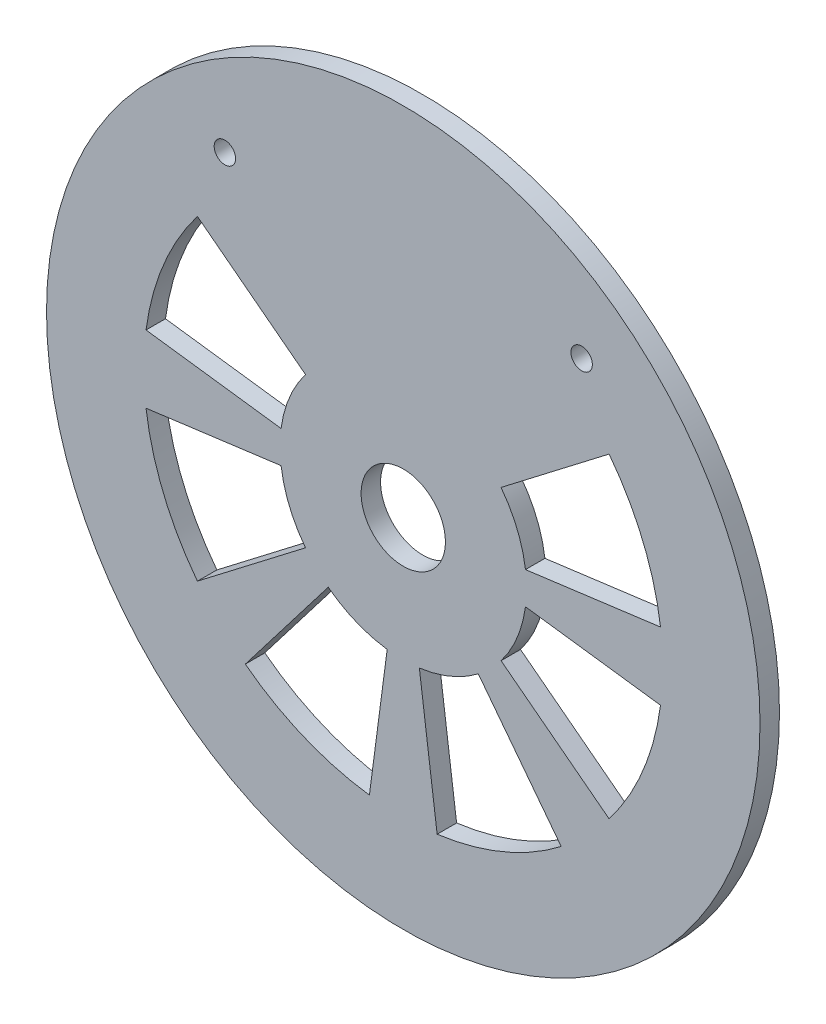
ISO-10303-21;
HEADER;
FILE_DESCRIPTION(('STEP AP214'),'2;1');
FILE_NAME('part.step','',(''),(''),'','','');
FILE_SCHEMA(('AUTOMOTIVE_DESIGN { 1 0 10303 214 1 1 1 1 }'));
ENDSEC;
DATA;
#1=APPLICATION_CONTEXT('core data for automotive mechanical design processes');
#2=APPLICATION_PROTOCOL_DEFINITION('international standard','automotive_design',2000,#1);
#3=PRODUCT_CONTEXT('',#1,'mechanical');
#4=PRODUCT('Part','Part','',(#3));
#5=PRODUCT_RELATED_PRODUCT_CATEGORY('part','',(#4));
#6=PRODUCT_DEFINITION_FORMATION('','',#4);
#7=PRODUCT_DEFINITION_CONTEXT('part definition',#1,'design');
#8=PRODUCT_DEFINITION('design','',#6,#7);
#9=PRODUCT_DEFINITION_SHAPE('','',#8);
#10=(LENGTH_UNIT() NAMED_UNIT(*) SI_UNIT(.MILLI.,.METRE.));
#11=(NAMED_UNIT(*) PLANE_ANGLE_UNIT() SI_UNIT($,.RADIAN.));
#12=(NAMED_UNIT(*) SI_UNIT($,.STERADIAN.) SOLID_ANGLE_UNIT());
#13=UNCERTAINTY_MEASURE_WITH_UNIT(LENGTH_MEASURE(1.E-05),#10,'distance_accuracy_value','');
#14=(GEOMETRIC_REPRESENTATION_CONTEXT(3) GLOBAL_UNCERTAINTY_ASSIGNED_CONTEXT((#13)) GLOBAL_UNIT_ASSIGNED_CONTEXT((#10,
#11,#12)) REPRESENTATION_CONTEXT('',''));
#15=CARTESIAN_POINT('',(0.,0.,0.));
#16=DIRECTION('',(0.,0.,1.));
#17=DIRECTION('',(1.,0.,0.));
#18=AXIS2_PLACEMENT_3D('',#15,#16,#17);
#19=CARTESIAN_POINT('',(0.,0.,3.));
#20=DIRECTION('',(0.,0.,1.));
#21=DIRECTION('',(1.,0.,0.));
#22=AXIS2_PLACEMENT_3D('',#19,#20,#21);
#23=PLANE('',#22);
#24=CARTESIAN_POINT('',(0.,0.,3.));
#25=DIRECTION('',(0.,0.,1.));
#26=DIRECTION('',(1.,0.,0.));
#27=AXIS2_PLACEMENT_3D('',#24,#25,#26);
#28=CIRCLE('',#27,6.5);
#29=CARTESIAN_POINT('',(6.5,0.,3.));
#30=VERTEX_POINT('',#29);
#31=EDGE_CURVE('E295',#30,#30,#28,.T.);
#32=ORIENTED_EDGE('',*,*,#31,.F.);
#33=EDGE_LOOP('',(#32));
#34=FACE_BOUND('',#33,.T.);
#35=CARTESIAN_POINT('',(27.5,35.,3.));
#36=DIRECTION('',(0.,0.,1.));
#37=DIRECTION('',(1.,0.,0.));
#38=AXIS2_PLACEMENT_3D('',#35,#36,#37);
#39=CIRCLE('',#38,1.65);
#40=CARTESIAN_POINT('',(29.15,35.,3.));
#41=VERTEX_POINT('',#40);
#42=EDGE_CURVE('E531',#41,#41,#39,.T.);
#43=ORIENTED_EDGE('',*,*,#42,.F.);
#44=EDGE_LOOP('',(#43));
#45=FACE_BOUND('',#44,.T.);
#46=CARTESIAN_POINT('',(-27.5,35.,3.));
#47=DIRECTION('',(0.,0.,1.));
#48=DIRECTION('',(1.,0.,0.));
#49=AXIS2_PLACEMENT_3D('',#46,#47,#48);
#50=CIRCLE('',#49,1.65);
#51=CARTESIAN_POINT('',(-25.85,35.,3.));
#52=VERTEX_POINT('',#51);
#53=EDGE_CURVE('E540',#52,#52,#50,.T.);
#54=ORIENTED_EDGE('',*,*,#53,.F.);
#55=EDGE_LOOP('',(#54));
#56=FACE_BOUND('',#55,.T.);
#57=CARTESIAN_POINT('',(0.,0.,3.));
#58=DIRECTION('',(0.,0.,1.));
#59=DIRECTION('',(1.,0.,0.));
#60=AXIS2_PLACEMENT_3D('',#57,#58,#59);
#61=CIRCLE('',#60,55.);
#62=CARTESIAN_POINT('',(55.,0.,3.));
#63=VERTEX_POINT('',#62);
#64=EDGE_CURVE('E12',#63,#63,#61,.T.);
#65=ORIENTED_EDGE('',*,*,#64,.T.);
#66=EDGE_LOOP('',(#65));
#67=FACE_BOUND('',#66,.T.);
#68=DIRECTION('',(0.99144486137381,0.130526192220053,0.));
#69=VECTOR('',#68,1.);
#70=CARTESIAN_POINT('',(0.,0.,3.));
#71=LINE('',#70,#69);
#72=CARTESIAN_POINT('',(18.8374523661024,2.479997652181,3.));
#73=VERTEX_POINT('',#72);
#74=CARTESIAN_POINT('',(39.6577944549524,5.22104768880211,3.));
#75=VERTEX_POINT('',#74);
#76=EDGE_CURVE('E503',#73,#75,#71,.T.);
#77=ORIENTED_EDGE('',*,*,#76,.F.);
#78=CARTESIAN_POINT('',(0.,0.,3.));
#79=DIRECTION('',(0.,0.,1.));
#80=DIRECTION('',(1.,0.,0.));
#81=AXIS2_PLACEMENT_3D('',#78,#79,#80);
#82=CIRCLE('',#81,19.);
#83=CARTESIAN_POINT('',(15.0737134655334,11.5664671511657,3.));
#84=VERTEX_POINT('',#83);
#85=EDGE_CURVE('E433',#73,#84,#82,.T.);
#86=ORIENTED_EDGE('',*,*,#85,.T.);
#87=DIRECTION('',(0.793353340291234,0.608761429008723,0.));
#88=VECTOR('',#87,1.);
#89=CARTESIAN_POINT('',(0.,0.,3.));
#90=LINE('',#89,#88);
#91=CARTESIAN_POINT('',(31.7341336116493,24.3504571603489,3.));
#92=VERTEX_POINT('',#91);
#93=EDGE_CURVE('E487',#84,#92,#90,.T.);
#94=ORIENTED_EDGE('',*,*,#93,.T.);
#95=CARTESIAN_POINT('',(0.,0.,3.));
#96=DIRECTION('',(0.,0.,1.));
#97=DIRECTION('',(1.,0.,0.));
#98=AXIS2_PLACEMENT_3D('',#95,#96,#97);
#99=CIRCLE('',#98,40.);
#100=EDGE_CURVE('E506',#75,#92,#99,.T.);
#101=ORIENTED_EDGE('',*,*,#100,.F.);
#102=EDGE_LOOP('',(#77,#86,#94,#101));
#103=FACE_BOUND('',#102,.T.);
#104=DIRECTION('',(0.793353340291235,-0.608761429008721,0.));
#105=VECTOR('',#104,1.);
#106=CARTESIAN_POINT('',(0.,0.,3.));
#107=LINE('',#106,#105);
#108=CARTESIAN_POINT('',(15.0737134655335,-11.5664671511657,3.));
#109=VERTEX_POINT('',#108);
#110=CARTESIAN_POINT('',(31.7341336116494,-24.3504571603489,3.));
#111=VERTEX_POINT('',#110);
#112=EDGE_CURVE('E303',#109,#111,#107,.T.);
#113=ORIENTED_EDGE('',*,*,#112,.F.);
#114=CARTESIAN_POINT('',(0.,0.,3.));
#115=DIRECTION('',(0.,0.,1.));
#116=DIRECTION('',(1.,0.,0.));
#117=AXIS2_PLACEMENT_3D('',#114,#115,#116);
#118=CIRCLE('',#117,19.);
#119=CARTESIAN_POINT('',(18.8374523661024,-2.47999765218096,3.));
#120=VERTEX_POINT('',#119);
#121=EDGE_CURVE('E262',#109,#120,#118,.T.);
#122=ORIENTED_EDGE('',*,*,#121,.T.);
#123=DIRECTION('',(0.991444861373811,-0.130526192220051,0.));
#124=VECTOR('',#123,1.);
#125=CARTESIAN_POINT('',(0.,0.,3.));
#126=LINE('',#125,#124);
#127=CARTESIAN_POINT('',(39.6577944549524,-5.22104768880203,3.));
#128=VERTEX_POINT('',#127);
#129=EDGE_CURVE('E284',#120,#128,#126,.T.);
#130=ORIENTED_EDGE('',*,*,#129,.T.);
#131=CARTESIAN_POINT('',(0.,0.,3.));
#132=DIRECTION('',(0.,0.,1.));
#133=DIRECTION('',(1.,0.,0.));
#134=AXIS2_PLACEMENT_3D('',#131,#132,#133);
#135=CIRCLE('',#134,40.);
#136=EDGE_CURVE('E287',#111,#128,#135,.T.);
#137=ORIENTED_EDGE('',*,*,#136,.F.);
#138=EDGE_LOOP('',(#113,#122,#130,#137));
#139=FACE_BOUND('',#138,.T.);
#140=DIRECTION('',(-0.793353340291231,0.608761429008727,0.));
#141=VECTOR('',#140,1.);
#142=CARTESIAN_POINT('',(0.,0.,3.));
#143=LINE('',#142,#141);
#144=CARTESIAN_POINT('',(-15.0737134655334,11.5664671511658,3.));
#145=VERTEX_POINT('',#144);
#146=CARTESIAN_POINT('',(-31.7341336116492,24.3504571603491,3.));
#147=VERTEX_POINT('',#146);
#148=EDGE_CURVE('E417',#145,#147,#143,.T.);
#149=ORIENTED_EDGE('',*,*,#148,.F.);
#150=CARTESIAN_POINT('',(0.,0.,3.));
#151=DIRECTION('',(0.,0.,1.));
#152=DIRECTION('',(1.,0.,0.));
#153=AXIS2_PLACEMENT_3D('',#150,#151,#152);
#154=CIRCLE('',#153,19.);
#155=CARTESIAN_POINT('',(-18.8374523661024,2.4799976521811,3.));
#156=VERTEX_POINT('',#155);
#157=EDGE_CURVE('E411',#145,#156,#154,.T.);
#158=ORIENTED_EDGE('',*,*,#157,.T.);
#159=DIRECTION('',(-0.99144486137381,0.130526192220058,0.));
#160=VECTOR('',#159,1.);
#161=CARTESIAN_POINT('',(0.,0.,3.));
#162=LINE('',#161,#160);
#163=CARTESIAN_POINT('',(-39.6577944549524,5.22104768880231,3.));
#164=VERTEX_POINT('',#163);
#165=EDGE_CURVE('E402',#156,#164,#162,.T.);
#166=ORIENTED_EDGE('',*,*,#165,.T.);
#167=CARTESIAN_POINT('',(0.,0.,3.));
#168=DIRECTION('',(0.,0.,1.));
#169=DIRECTION('',(1.,0.,0.));
#170=AXIS2_PLACEMENT_3D('',#167,#168,#169);
#171=CIRCLE('',#170,40.);
#172=EDGE_CURVE('E425',#147,#164,#171,.T.);
#173=ORIENTED_EDGE('',*,*,#172,.F.);
#174=EDGE_LOOP('',(#149,#158,#166,#173));
#175=FACE_BOUND('',#174,.T.);
#176=DIRECTION('',(-0.991444861373811,-0.130526192220046,0.));
#177=VECTOR('',#176,1.);
#178=CARTESIAN_POINT('',(0.,0.,3.));
#179=LINE('',#178,#177);
#180=CARTESIAN_POINT('',(-18.8374523661024,-2.47999765218087,3.));
#181=VERTEX_POINT('',#180);
#182=CARTESIAN_POINT('',(-39.6577944549524,-5.22104768880183,3.));
#183=VERTEX_POINT('',#182);
#184=EDGE_CURVE('E465',#181,#183,#179,.T.);
#185=ORIENTED_EDGE('',*,*,#184,.F.);
#186=CARTESIAN_POINT('',(0.,0.,3.));
#187=DIRECTION('',(0.,0.,1.));
#188=DIRECTION('',(1.,0.,0.));
#189=AXIS2_PLACEMENT_3D('',#186,#187,#188);
#190=CIRCLE('',#189,19.);
#191=CARTESIAN_POINT('',(-15.0737134655335,-11.5664671511656,3.));
#192=VERTEX_POINT('',#191);
#193=EDGE_CURVE('E349',#181,#192,#190,.T.);
#194=ORIENTED_EDGE('',*,*,#193,.T.);
#195=DIRECTION('',(-0.793353340291238,-0.608761429008717,0.));
#196=VECTOR('',#195,1.);
#197=CARTESIAN_POINT('',(0.,0.,3.));
#198=LINE('',#197,#196);
#199=CARTESIAN_POINT('',(-31.7341336116495,-24.3504571603487,3.));
#200=VERTEX_POINT('',#199);
#201=EDGE_CURVE('E450',#192,#200,#198,.T.);
#202=ORIENTED_EDGE('',*,*,#201,.T.);
#203=CARTESIAN_POINT('',(0.,0.,3.));
#204=DIRECTION('',(0.,0.,1.));
#205=DIRECTION('',(1.,0.,0.));
#206=AXIS2_PLACEMENT_3D('',#203,#204,#205);
#207=CIRCLE('',#206,40.);
#208=EDGE_CURVE('E468',#183,#200,#207,.T.);
#209=ORIENTED_EDGE('',*,*,#208,.F.);
#210=EDGE_LOOP('',(#185,#194,#202,#209));
#211=FACE_BOUND('',#210,.T.);
#212=DIRECTION('',(-0.608761429008724,-0.793353340291233,0.));
#213=VECTOR('',#212,1.);
#214=CARTESIAN_POINT('',(0.,0.,3.));
#215=LINE('',#214,#213);
#216=CARTESIAN_POINT('',(-11.5664671511658,-15.0737134655334,3.));
#217=VERTEX_POINT('',#216);
#218=CARTESIAN_POINT('',(-24.350457160349,-31.7341336116493,3.));
#219=VERTEX_POINT('',#218);
#220=EDGE_CURVE('E331',#217,#219,#215,.T.);
#221=ORIENTED_EDGE('',*,*,#220,.F.);
#222=CARTESIAN_POINT('',(0.,0.,3.));
#223=DIRECTION('',(0.,0.,1.));
#224=DIRECTION('',(1.,0.,0.));
#225=AXIS2_PLACEMENT_3D('',#222,#223,#224);
#226=CIRCLE('',#225,19.);
#227=CARTESIAN_POINT('',(-2.47999765218103,-18.8374523661024,3.));
#228=VERTEX_POINT('',#227);
#229=EDGE_CURVE('E120',#217,#228,#226,.T.);
#230=ORIENTED_EDGE('',*,*,#229,.T.);
#231=DIRECTION('',(-0.130526192220054,-0.99144486137381,0.));
#232=VECTOR('',#231,1.);
#233=CARTESIAN_POINT('',(0.,0.,3.));
#234=LINE('',#233,#232);
#235=CARTESIAN_POINT('',(-5.22104768880218,-39.6577944549524,3.));
#236=VERTEX_POINT('',#235);
#237=EDGE_CURVE('E319',#228,#236,#234,.T.);
#238=ORIENTED_EDGE('',*,*,#237,.T.);
#239=CARTESIAN_POINT('',(0.,0.,3.));
#240=DIRECTION('',(0.,0.,1.));
#241=DIRECTION('',(1.,0.,0.));
#242=AXIS2_PLACEMENT_3D('',#239,#240,#241);
#243=CIRCLE('',#242,40.);
#244=EDGE_CURVE('E338',#219,#236,#243,.T.);
#245=ORIENTED_EDGE('',*,*,#244,.F.);
#246=EDGE_LOOP('',(#221,#230,#238,#245));
#247=FACE_BOUND('',#246,.T.);
#248=DIRECTION('',(0.130526192220049,-0.991444861373811,0.));
#249=VECTOR('',#248,1.);
#250=CARTESIAN_POINT('',(0.,0.,3.));
#251=LINE('',#250,#249);
#252=CARTESIAN_POINT('',(2.47999765218093,-18.8374523661024,3.));
#253=VERTEX_POINT('',#252);
#254=CARTESIAN_POINT('',(5.22104768880197,-39.6577944549524,3.));
#255=VERTEX_POINT('',#254);
#256=EDGE_CURVE('E376',#253,#255,#251,.T.);
#257=ORIENTED_EDGE('',*,*,#256,.F.);
#258=CARTESIAN_POINT('',(0.,0.,3.));
#259=DIRECTION('',(0.,0.,1.));
#260=DIRECTION('',(1.,0.,0.));
#261=AXIS2_PLACEMENT_3D('',#258,#259,#260);
#262=CIRCLE('',#261,19.);
#263=CARTESIAN_POINT('',(11.5664671511657,-15.0737134655335,3.));
#264=VERTEX_POINT('',#263);
#265=EDGE_CURVE('E108',#253,#264,#262,.T.);
#266=ORIENTED_EDGE('',*,*,#265,.T.);
#267=DIRECTION('',(0.60876142900872,-0.793353340291236,0.));
#268=VECTOR('',#267,1.);
#269=CARTESIAN_POINT('',(0.,0.,3.));
#270=LINE('',#269,#268);
#271=CARTESIAN_POINT('',(24.3504571603488,-31.7341336116494,3.));
#272=VERTEX_POINT('',#271);
#273=EDGE_CURVE('E362',#264,#272,#270,.T.);
#274=ORIENTED_EDGE('',*,*,#273,.T.);
#275=CARTESIAN_POINT('',(0.,0.,3.));
#276=DIRECTION('',(0.,0.,1.));
#277=DIRECTION('',(1.,0.,0.));
#278=AXIS2_PLACEMENT_3D('',#275,#276,#277);
#279=CIRCLE('',#278,40.);
#280=EDGE_CURVE('E379',#255,#272,#279,.T.);
#281=ORIENTED_EDGE('',*,*,#280,.F.);
#282=EDGE_LOOP('',(#257,#266,#274,#281));
#283=FACE_BOUND('',#282,.T.);
#284=ADVANCED_FACE('F91',(#34,#45,#56,#67,#103,#139,#175,#211,#247,#283),#23,.T.);
#285=CARTESIAN_POINT('',(0.,0.,0.));
#286=DIRECTION('',(0.,0.,1.));
#287=DIRECTION('',(1.,0.,0.));
#288=AXIS2_PLACEMENT_3D('',#285,#286,#287);
#289=PLANE('',#288);
#290=CARTESIAN_POINT('',(0.,0.,0.));
#291=DIRECTION('',(0.,0.,1.));
#292=DIRECTION('',(1.,0.,0.));
#293=AXIS2_PLACEMENT_3D('',#290,#291,#292);
#294=CIRCLE('',#293,6.5);
#295=CARTESIAN_POINT('',(6.5,0.,0.));
#296=VERTEX_POINT('',#295);
#297=EDGE_CURVE('E305',#296,#296,#294,.T.);
#298=ORIENTED_EDGE('',*,*,#297,.T.);
#299=EDGE_LOOP('',(#298));
#300=FACE_BOUND('',#299,.T.);
#301=CARTESIAN_POINT('',(0.,0.,0.));
#302=DIRECTION('',(0.,0.,1.));
#303=DIRECTION('',(1.,0.,0.));
#304=AXIS2_PLACEMENT_3D('',#301,#302,#303);
#305=CIRCLE('',#304,19.);
#306=CARTESIAN_POINT('',(-11.5664671511658,-15.0737134655334,0.));
#307=VERTEX_POINT('',#306);
#308=CARTESIAN_POINT('',(-2.47999765218103,-18.8374523661024,0.));
#309=VERTEX_POINT('',#308);
#310=EDGE_CURVE('E316',#307,#309,#305,.T.);
#311=ORIENTED_EDGE('',*,*,#310,.F.);
#312=DIRECTION('',(-0.608761429008724,-0.793353340291233,0.));
#313=VECTOR('',#312,1.);
#314=CARTESIAN_POINT('',(0.,0.,0.));
#315=LINE('',#314,#313);
#316=CARTESIAN_POINT('',(-24.350457160349,-31.7341336116493,0.));
#317=VERTEX_POINT('',#316);
#318=EDGE_CURVE('E317',#307,#317,#315,.T.);
#319=ORIENTED_EDGE('',*,*,#318,.T.);
#320=CARTESIAN_POINT('',(0.,0.,0.));
#321=DIRECTION('',(0.,0.,1.));
#322=DIRECTION('',(1.,0.,0.));
#323=AXIS2_PLACEMENT_3D('',#320,#321,#322);
#324=CIRCLE('',#323,40.);
#325=CARTESIAN_POINT('',(-5.22104768880218,-39.6577944549524,0.));
#326=VERTEX_POINT('',#325);
#327=EDGE_CURVE('E322',#317,#326,#324,.T.);
#328=ORIENTED_EDGE('',*,*,#327,.T.);
#329=DIRECTION('',(-0.130526192220054,-0.99144486137381,0.));
#330=VECTOR('',#329,1.);
#331=CARTESIAN_POINT('',(0.,0.,0.));
#332=LINE('',#331,#330);
#333=EDGE_CURVE('E327',#309,#326,#332,.T.);
#334=ORIENTED_EDGE('',*,*,#333,.F.);
#335=EDGE_LOOP('',(#311,#319,#328,#334));
#336=FACE_BOUND('',#335,.T.);
#337=CARTESIAN_POINT('',(0.,0.,0.));
#338=DIRECTION('',(0.,0.,1.));
#339=DIRECTION('',(1.,0.,0.));
#340=AXIS2_PLACEMENT_3D('',#337,#338,#339);
#341=CIRCLE('',#340,19.);
#342=CARTESIAN_POINT('',(-15.0737134655334,11.5664671511658,0.));
#343=VERTEX_POINT('',#342);
#344=CARTESIAN_POINT('',(-18.8374523661024,2.4799976521811,0.));
#345=VERTEX_POINT('',#344);
#346=EDGE_CURVE('E400',#343,#345,#341,.T.);
#347=ORIENTED_EDGE('',*,*,#346,.F.);
#348=DIRECTION('',(-0.793353340291231,0.608761429008727,0.));
#349=VECTOR('',#348,1.);
#350=CARTESIAN_POINT('',(0.,0.,0.));
#351=LINE('',#350,#349);
#352=CARTESIAN_POINT('',(-31.7341336116492,24.3504571603491,0.));
#353=VERTEX_POINT('',#352);
#354=EDGE_CURVE('E399',#343,#353,#351,.T.);
#355=ORIENTED_EDGE('',*,*,#354,.T.);
#356=CARTESIAN_POINT('',(0.,0.,0.));
#357=DIRECTION('',(0.,0.,1.));
#358=DIRECTION('',(1.,0.,0.));
#359=AXIS2_PLACEMENT_3D('',#356,#357,#358);
#360=CIRCLE('',#359,40.);
#361=CARTESIAN_POINT('',(-39.6577944549524,5.22104768880231,0.));
#362=VERTEX_POINT('',#361);
#363=EDGE_CURVE('E403',#353,#362,#360,.T.);
#364=ORIENTED_EDGE('',*,*,#363,.T.);
#365=DIRECTION('',(-0.99144486137381,0.130526192220058,0.));
#366=VECTOR('',#365,1.);
#367=CARTESIAN_POINT('',(0.,0.,0.));
#368=LINE('',#367,#366);
#369=EDGE_CURVE('E408',#345,#362,#368,.T.);
#370=ORIENTED_EDGE('',*,*,#369,.F.);
#371=EDGE_LOOP('',(#347,#355,#364,#370));
#372=FACE_BOUND('',#371,.T.);
#373=CARTESIAN_POINT('',(0.,0.,0.));
#374=DIRECTION('',(0.,0.,1.));
#375=DIRECTION('',(1.,0.,0.));
#376=AXIS2_PLACEMENT_3D('',#373,#374,#375);
#377=CIRCLE('',#376,19.);
#378=CARTESIAN_POINT('',(18.8374523661024,2.479997652181,0.));
#379=VERTEX_POINT('',#378);
#380=CARTESIAN_POINT('',(15.0737134655334,11.5664671511657,0.));
#381=VERTEX_POINT('',#380);
#382=EDGE_CURVE('E484',#379,#381,#377,.T.);
#383=ORIENTED_EDGE('',*,*,#382,.F.);
#384=DIRECTION('',(0.99144486137381,0.130526192220053,0.));
#385=VECTOR('',#384,1.);
#386=CARTESIAN_POINT('',(0.,0.,0.));
#387=LINE('',#386,#385);
#388=CARTESIAN_POINT('',(39.6577944549524,5.22104768880211,0.));
#389=VERTEX_POINT('',#388);
#390=EDGE_CURVE('E488',#379,#389,#387,.T.);
#391=ORIENTED_EDGE('',*,*,#390,.T.);
#392=CARTESIAN_POINT('',(0.,0.,0.));
#393=DIRECTION('',(0.,0.,1.));
#394=DIRECTION('',(1.,0.,0.));
#395=AXIS2_PLACEMENT_3D('',#392,#393,#394);
#396=CIRCLE('',#395,40.);
#397=CARTESIAN_POINT('',(31.7341336116493,24.3504571603489,0.));
#398=VERTEX_POINT('',#397);
#399=EDGE_CURVE('E492',#389,#398,#396,.T.);
#400=ORIENTED_EDGE('',*,*,#399,.T.);
#401=DIRECTION('',(0.793353340291234,0.608761429008723,0.));
#402=VECTOR('',#401,1.);
#403=CARTESIAN_POINT('',(0.,0.,0.));
#404=LINE('',#403,#402);
#405=EDGE_CURVE('E500',#381,#398,#404,.T.);
#406=ORIENTED_EDGE('',*,*,#405,.F.);
#407=EDGE_LOOP('',(#383,#391,#400,#406));
#408=FACE_BOUND('',#407,.T.);
#409=CARTESIAN_POINT('',(27.5,35.,0.));
#410=DIRECTION('',(0.,0.,1.));
#411=DIRECTION('',(1.,0.,0.));
#412=AXIS2_PLACEMENT_3D('',#409,#410,#411);
#413=CIRCLE('',#412,1.65);
#414=CARTESIAN_POINT('',(29.15,35.,0.));
#415=VERTEX_POINT('',#414);
#416=EDGE_CURVE('E530',#415,#415,#413,.T.);
#417=ORIENTED_EDGE('',*,*,#416,.T.);
#418=EDGE_LOOP('',(#417));
#419=FACE_BOUND('',#418,.T.);
#420=CARTESIAN_POINT('',(-27.5,35.,0.));
#421=DIRECTION('',(0.,0.,1.));
#422=DIRECTION('',(1.,0.,0.));
#423=AXIS2_PLACEMENT_3D('',#420,#421,#422);
#424=CIRCLE('',#423,1.65);
#425=CARTESIAN_POINT('',(-25.85,35.,0.));
#426=VERTEX_POINT('',#425);
#427=EDGE_CURVE('E518',#426,#426,#424,.T.);
#428=ORIENTED_EDGE('',*,*,#427,.T.);
#429=EDGE_LOOP('',(#428));
#430=FACE_BOUND('',#429,.T.);
#431=CARTESIAN_POINT('',(0.,0.,0.));
#432=DIRECTION('',(0.,0.,1.));
#433=DIRECTION('',(1.,0.,0.));
#434=AXIS2_PLACEMENT_3D('',#431,#432,#433);
#435=CIRCLE('',#434,55.);
#436=CARTESIAN_POINT('',(55.,0.,0.));
#437=VERTEX_POINT('',#436);
#438=EDGE_CURVE('E100',#437,#437,#435,.T.);
#439=ORIENTED_EDGE('',*,*,#438,.F.);
#440=EDGE_LOOP('',(#439));
#441=FACE_BOUND('',#440,.T.);
#442=CARTESIAN_POINT('',(0.,0.,0.));
#443=DIRECTION('',(0.,0.,1.));
#444=DIRECTION('',(1.,0.,0.));
#445=AXIS2_PLACEMENT_3D('',#442,#443,#444);
#446=CIRCLE('',#445,19.);
#447=CARTESIAN_POINT('',(15.0737134655335,-11.5664671511657,0.));
#448=VERTEX_POINT('',#447);
#449=CARTESIAN_POINT('',(18.8374523661024,-2.47999765218096,0.));
#450=VERTEX_POINT('',#449);
#451=EDGE_CURVE('E261',#448,#450,#446,.T.);
#452=ORIENTED_EDGE('',*,*,#451,.F.);
#453=DIRECTION('',(0.793353340291235,-0.608761429008721,0.));
#454=VECTOR('',#453,1.);
#455=CARTESIAN_POINT('',(0.,0.,0.));
#456=LINE('',#455,#454);
#457=CARTESIAN_POINT('',(31.7341336116494,-24.3504571603489,0.));
#458=VERTEX_POINT('',#457);
#459=EDGE_CURVE('E273',#448,#458,#456,.T.);
#460=ORIENTED_EDGE('',*,*,#459,.T.);
#461=CARTESIAN_POINT('',(0.,0.,0.));
#462=DIRECTION('',(0.,0.,1.));
#463=DIRECTION('',(1.,0.,0.));
#464=AXIS2_PLACEMENT_3D('',#461,#462,#463);
#465=CIRCLE('',#464,40.);
#466=CARTESIAN_POINT('',(39.6577944549524,-5.22104768880203,0.));
#467=VERTEX_POINT('',#466);
#468=EDGE_CURVE('E276',#458,#467,#465,.T.);
#469=ORIENTED_EDGE('',*,*,#468,.T.);
#470=DIRECTION('',(0.991444861373811,-0.130526192220051,0.));
#471=VECTOR('',#470,1.);
#472=CARTESIAN_POINT('',(0.,0.,0.));
#473=LINE('',#472,#471);
#474=EDGE_CURVE('E269',#450,#467,#473,.T.);
#475=ORIENTED_EDGE('',*,*,#474,.F.);
#476=EDGE_LOOP('',(#452,#460,#469,#475));
#477=FACE_BOUND('',#476,.T.);
#478=CARTESIAN_POINT('',(0.,0.,0.));
#479=DIRECTION('',(0.,0.,1.));
#480=DIRECTION('',(1.,0.,0.));
#481=AXIS2_PLACEMENT_3D('',#478,#479,#480);
#482=CIRCLE('',#481,19.);
#483=CARTESIAN_POINT('',(-18.8374523661024,-2.47999765218087,0.));
#484=VERTEX_POINT('',#483);
#485=CARTESIAN_POINT('',(-15.0737134655335,-11.5664671511656,0.));
#486=VERTEX_POINT('',#485);
#487=EDGE_CURVE('E444',#484,#486,#482,.T.);
#488=ORIENTED_EDGE('',*,*,#487,.F.);
#489=DIRECTION('',(-0.991444861373811,-0.130526192220046,0.));
#490=VECTOR('',#489,1.);
#491=CARTESIAN_POINT('',(0.,0.,0.));
#492=LINE('',#491,#490);
#493=CARTESIAN_POINT('',(-39.6577944549524,-5.22104768880183,0.));
#494=VERTEX_POINT('',#493);
#495=EDGE_CURVE('E446',#484,#494,#492,.T.);
#496=ORIENTED_EDGE('',*,*,#495,.T.);
#497=CARTESIAN_POINT('',(0.,0.,0.));
#498=DIRECTION('',(0.,0.,1.));
#499=DIRECTION('',(1.,0.,0.));
#500=AXIS2_PLACEMENT_3D('',#497,#498,#499);
#501=CIRCLE('',#500,40.);
#502=CARTESIAN_POINT('',(-31.7341336116495,-24.3504571603487,0.));
#503=VERTEX_POINT('',#502);
#504=EDGE_CURVE('E453',#494,#503,#501,.T.);
#505=ORIENTED_EDGE('',*,*,#504,.T.);
#506=DIRECTION('',(-0.793353340291238,-0.608761429008717,0.));
#507=VECTOR('',#506,1.);
#508=CARTESIAN_POINT('',(0.,0.,0.));
#509=LINE('',#508,#507);
#510=EDGE_CURVE('E454',#486,#503,#509,.T.);
#511=ORIENTED_EDGE('',*,*,#510,.F.);
#512=EDGE_LOOP('',(#488,#496,#505,#511));
#513=FACE_BOUND('',#512,.T.);
#514=CARTESIAN_POINT('',(0.,0.,0.));
#515=DIRECTION('',(0.,0.,1.));
#516=DIRECTION('',(1.,0.,0.));
#517=AXIS2_PLACEMENT_3D('',#514,#515,#516);
#518=CIRCLE('',#517,19.);
#519=CARTESIAN_POINT('',(2.47999765218093,-18.8374523661024,0.));
#520=VERTEX_POINT('',#519);
#521=CARTESIAN_POINT('',(11.5664671511657,-15.0737134655335,0.));
#522=VERTEX_POINT('',#521);
#523=EDGE_CURVE('E356',#520,#522,#518,.T.);
#524=ORIENTED_EDGE('',*,*,#523,.F.);
#525=DIRECTION('',(0.130526192220049,-0.991444861373811,0.));
#526=VECTOR('',#525,1.);
#527=CARTESIAN_POINT('',(0.,0.,0.));
#528=LINE('',#527,#526);
#529=CARTESIAN_POINT('',(5.22104768880197,-39.6577944549524,0.));
#530=VERTEX_POINT('',#529);
#531=EDGE_CURVE('E363',#520,#530,#528,.T.);
#532=ORIENTED_EDGE('',*,*,#531,.T.);
#533=CARTESIAN_POINT('',(0.,0.,0.));
#534=DIRECTION('',(0.,0.,1.));
#535=DIRECTION('',(1.,0.,0.));
#536=AXIS2_PLACEMENT_3D('',#533,#534,#535);
#537=CIRCLE('',#536,40.);
#538=CARTESIAN_POINT('',(24.3504571603488,-31.7341336116494,0.));
#539=VERTEX_POINT('',#538);
#540=EDGE_CURVE('E368',#530,#539,#537,.T.);
#541=ORIENTED_EDGE('',*,*,#540,.T.);
#542=DIRECTION('',(0.60876142900872,-0.793353340291236,0.));
#543=VECTOR('',#542,1.);
#544=CARTESIAN_POINT('',(0.,0.,0.));
#545=LINE('',#544,#543);
#546=EDGE_CURVE('E367',#522,#539,#545,.T.);
#547=ORIENTED_EDGE('',*,*,#546,.F.);
#548=EDGE_LOOP('',(#524,#532,#541,#547));
#549=FACE_BOUND('',#548,.T.);
#550=ADVANCED_FACE('F285',(#300,#336,#372,#408,#419,#430,#441,#477,#513,#549),#289,.F.);
#551=CARTESIAN_POINT('',(0.,0.,3.));
#552=DIRECTION('',(0.,0.,-1.));
#553=DIRECTION('',(-1.,0.,0.));
#554=AXIS2_PLACEMENT_3D('',#551,#552,#553);
#555=CYLINDRICAL_SURFACE('',#554,55.);
#556=ORIENTED_EDGE('',*,*,#64,.F.);
#557=EDGE_LOOP('',(#556));
#558=FACE_BOUND('',#557,.T.);
#559=ORIENTED_EDGE('',*,*,#438,.T.);
#560=EDGE_LOOP('',(#559));
#561=FACE_BOUND('',#560,.T.);
#562=ADVANCED_FACE('F92',(#558,#561),#555,.T.);
#563=CARTESIAN_POINT('',(-27.5,35.,0.));
#564=DIRECTION('',(0.,0.,1.));
#565=DIRECTION('',(1.,0.,0.));
#566=AXIS2_PLACEMENT_3D('',#563,#564,#565);
#567=CYLINDRICAL_SURFACE('',#566,1.65);
#568=ORIENTED_EDGE('',*,*,#427,.F.);
#569=EDGE_LOOP('',(#568));
#570=FACE_BOUND('',#569,.T.);
#571=ORIENTED_EDGE('',*,*,#53,.T.);
#572=EDGE_LOOP('',(#571));
#573=FACE_BOUND('',#572,.T.);
#574=ADVANCED_FACE('F550',(#570,#573),#567,.F.);
#575=CARTESIAN_POINT('',(27.5,35.,0.));
#576=DIRECTION('',(0.,0.,1.));
#577=DIRECTION('',(1.,0.,0.));
#578=AXIS2_PLACEMENT_3D('',#575,#576,#577);
#579=CYLINDRICAL_SURFACE('',#578,1.65);
#580=ORIENTED_EDGE('',*,*,#416,.F.);
#581=EDGE_LOOP('',(#580));
#582=FACE_BOUND('',#581,.T.);
#583=ORIENTED_EDGE('',*,*,#42,.T.);
#584=EDGE_LOOP('',(#583));
#585=FACE_BOUND('',#584,.T.);
#586=ADVANCED_FACE('F549',(#582,#585),#579,.F.);
#587=CARTESIAN_POINT('',(0.,0.,0.));
#588=DIRECTION('',(0.,0.,1.));
#589=DIRECTION('',(1.,0.,0.));
#590=AXIS2_PLACEMENT_3D('',#587,#588,#589);
#591=CYLINDRICAL_SURFACE('',#590,19.);
#592=ORIENTED_EDGE('',*,*,#85,.F.);
#593=DIRECTION('',(0.,0.,1.));
#594=VECTOR('',#593,1.);
#595=CARTESIAN_POINT('',(18.8374523661024,2.479997652181,0.));
#596=LINE('',#595,#594);
#597=EDGE_CURVE('E498',#379,#73,#596,.T.);
#598=ORIENTED_EDGE('',*,*,#597,.F.);
#599=ORIENTED_EDGE('',*,*,#382,.T.);
#600=DIRECTION('',(0.,0.,1.));
#601=VECTOR('',#600,1.);
#602=CARTESIAN_POINT('',(15.0737134655334,11.5664671511657,0.));
#603=LINE('',#602,#601);
#604=EDGE_CURVE('E513',#381,#84,#603,.T.);
#605=ORIENTED_EDGE('',*,*,#604,.T.);
#606=EDGE_LOOP('',(#592,#598,#599,#605));
#607=FACE_BOUND('',#606,.T.);
#608=ADVANCED_FACE('F643',(#607),#591,.T.);
#609=CARTESIAN_POINT('',(0.,0.,0.));
#610=DIRECTION('',(0.608761429008723,-0.793353340291233,0.));
#611=DIRECTION('',(0.793353340291234,0.608761429008723,0.));
#612=AXIS2_PLACEMENT_3D('',#609,#610,#611);
#613=PLANE('',#612);
#614=ORIENTED_EDGE('',*,*,#93,.F.);
#615=ORIENTED_EDGE('',*,*,#604,.F.);
#616=ORIENTED_EDGE('',*,*,#405,.T.);
#617=DIRECTION('',(0.,0.,1.));
#618=VECTOR('',#617,1.);
#619=CARTESIAN_POINT('',(31.7341336116493,24.3504571603489,0.));
#620=LINE('',#619,#618);
#621=EDGE_CURVE('E519',#398,#92,#620,.T.);
#622=ORIENTED_EDGE('',*,*,#621,.T.);
#623=EDGE_LOOP('',(#614,#615,#616,#622));
#624=FACE_BOUND('',#623,.T.);
#625=ADVANCED_FACE('F637',(#624),#613,.T.);
#626=CARTESIAN_POINT('',(0.,0.,0.));
#627=DIRECTION('',(0.,0.,1.));
#628=DIRECTION('',(1.,0.,0.));
#629=AXIS2_PLACEMENT_3D('',#626,#627,#628);
#630=CYLINDRICAL_SURFACE('',#629,40.);
#631=ORIENTED_EDGE('',*,*,#100,.T.);
#632=ORIENTED_EDGE('',*,*,#621,.F.);
#633=ORIENTED_EDGE('',*,*,#399,.F.);
#634=DIRECTION('',(0.,0.,1.));
#635=VECTOR('',#634,1.);
#636=CARTESIAN_POINT('',(39.6577944549524,5.22104768880211,0.));
#637=LINE('',#636,#635);
#638=EDGE_CURVE('E521',#389,#75,#637,.T.);
#639=ORIENTED_EDGE('',*,*,#638,.T.);
#640=EDGE_LOOP('',(#631,#632,#633,#639));
#641=FACE_BOUND('',#640,.T.);
#642=ADVANCED_FACE('F639',(#641),#630,.F.);
#643=CARTESIAN_POINT('',(0.,0.,0.));
#644=DIRECTION('',(0.130526192220053,-0.99144486137381,0.));
#645=DIRECTION('',(0.99144486137381,0.130526192220053,0.));
#646=AXIS2_PLACEMENT_3D('',#643,#644,#645);
#647=PLANE('',#646);
#648=ORIENTED_EDGE('',*,*,#76,.T.);
#649=ORIENTED_EDGE('',*,*,#638,.F.);
#650=ORIENTED_EDGE('',*,*,#390,.F.);
#651=ORIENTED_EDGE('',*,*,#597,.T.);
#652=EDGE_LOOP('',(#648,#649,#650,#651));
#653=FACE_BOUND('',#652,.T.);
#654=ADVANCED_FACE('F642',(#653),#647,.F.);
#655=CARTESIAN_POINT('',(0.,0.,0.));
#656=DIRECTION('',(0.,0.,1.));
#657=DIRECTION('',(1.,0.,0.));
#658=AXIS2_PLACEMENT_3D('',#655,#656,#657);
#659=CYLINDRICAL_SURFACE('',#658,19.);
#660=ORIENTED_EDGE('',*,*,#121,.F.);
#661=DIRECTION('',(0.,0.,1.));
#662=VECTOR('',#661,1.);
#663=CARTESIAN_POINT('',(15.0737134655335,-11.5664671511657,0.));
#664=LINE('',#663,#662);
#665=EDGE_CURVE('E258',#448,#109,#664,.T.);
#666=ORIENTED_EDGE('',*,*,#665,.F.);
#667=ORIENTED_EDGE('',*,*,#451,.T.);
#668=DIRECTION('',(0.,0.,1.));
#669=VECTOR('',#668,1.);
#670=CARTESIAN_POINT('',(18.8374523661024,-2.47999765218096,0.));
#671=LINE('',#670,#669);
#672=EDGE_CURVE('E306',#450,#120,#671,.T.);
#673=ORIENTED_EDGE('',*,*,#672,.T.);
#674=EDGE_LOOP('',(#660,#666,#667,#673));
#675=FACE_BOUND('',#674,.T.);
#676=ADVANCED_FACE('F256',(#675),#659,.T.);
#677=CARTESIAN_POINT('',(0.,0.,0.));
#678=DIRECTION('',(-0.130526192220051,-0.99144486137381,0.));
#679=DIRECTION('',(0.991444861373811,-0.130526192220051,0.));
#680=AXIS2_PLACEMENT_3D('',#677,#678,#679);
#681=PLANE('',#680);
#682=ORIENTED_EDGE('',*,*,#129,.F.);
#683=ORIENTED_EDGE('',*,*,#672,.F.);
#684=ORIENTED_EDGE('',*,*,#474,.T.);
#685=DIRECTION('',(0.,0.,1.));
#686=VECTOR('',#685,1.);
#687=CARTESIAN_POINT('',(39.6577944549524,-5.22104768880203,0.));
#688=LINE('',#687,#686);
#689=EDGE_CURVE('E313',#467,#128,#688,.T.);
#690=ORIENTED_EDGE('',*,*,#689,.T.);
#691=EDGE_LOOP('',(#682,#683,#684,#690));
#692=FACE_BOUND('',#691,.T.);
#693=ADVANCED_FACE('F711',(#692),#681,.T.);
#694=CARTESIAN_POINT('',(0.,0.,0.));
#695=DIRECTION('',(0.,0.,1.));
#696=DIRECTION('',(1.,0.,0.));
#697=AXIS2_PLACEMENT_3D('',#694,#695,#696);
#698=CYLINDRICAL_SURFACE('',#697,40.);
#699=ORIENTED_EDGE('',*,*,#136,.T.);
#700=ORIENTED_EDGE('',*,*,#689,.F.);
#701=ORIENTED_EDGE('',*,*,#468,.F.);
#702=DIRECTION('',(0.,0.,1.));
#703=VECTOR('',#702,1.);
#704=CARTESIAN_POINT('',(31.7341336116494,-24.3504571603489,0.));
#705=LINE('',#704,#703);
#706=EDGE_CURVE('E267',#458,#111,#705,.T.);
#707=ORIENTED_EDGE('',*,*,#706,.T.);
#708=EDGE_LOOP('',(#699,#700,#701,#707));
#709=FACE_BOUND('',#708,.T.);
#710=ADVANCED_FACE('F713',(#709),#698,.F.);
#711=CARTESIAN_POINT('',(0.,0.,0.));
#712=DIRECTION('',(-0.608761429008721,-0.793353340291235,0.));
#713=DIRECTION('',(0.793353340291235,-0.608761429008721,0.));
#714=AXIS2_PLACEMENT_3D('',#711,#712,#713);
#715=PLANE('',#714);
#716=ORIENTED_EDGE('',*,*,#112,.T.);
#717=ORIENTED_EDGE('',*,*,#706,.F.);
#718=ORIENTED_EDGE('',*,*,#459,.F.);
#719=ORIENTED_EDGE('',*,*,#665,.T.);
#720=EDGE_LOOP('',(#716,#717,#718,#719));
#721=FACE_BOUND('',#720,.T.);
#722=ADVANCED_FACE('F274',(#721),#715,.F.);
#723=CARTESIAN_POINT('',(0.,0.,0.));
#724=DIRECTION('',(0.,0.,1.));
#725=DIRECTION('',(1.,0.,0.));
#726=AXIS2_PLACEMENT_3D('',#723,#724,#725);
#727=CYLINDRICAL_SURFACE('',#726,19.);
#728=ORIENTED_EDGE('',*,*,#157,.F.);
#729=DIRECTION('',(0.,0.,1.));
#730=VECTOR('',#729,1.);
#731=CARTESIAN_POINT('',(-15.0737134655334,11.5664671511658,0.));
#732=LINE('',#731,#730);
#733=EDGE_CURVE('E415',#343,#145,#732,.T.);
#734=ORIENTED_EDGE('',*,*,#733,.F.);
#735=ORIENTED_EDGE('',*,*,#346,.T.);
#736=DIRECTION('',(0.,0.,1.));
#737=VECTOR('',#736,1.);
#738=CARTESIAN_POINT('',(-18.8374523661024,2.4799976521811,0.));
#739=LINE('',#738,#737);
#740=EDGE_CURVE('E427',#345,#156,#739,.T.);
#741=ORIENTED_EDGE('',*,*,#740,.T.);
#742=EDGE_LOOP('',(#728,#734,#735,#741));
#743=FACE_BOUND('',#742,.T.);
#744=ADVANCED_FACE('F609',(#743),#727,.T.);
#745=CARTESIAN_POINT('',(0.,0.,0.));
#746=DIRECTION('',(0.130526192220058,0.99144486137381,0.));
#747=DIRECTION('',(-0.99144486137381,0.130526192220058,0.));
#748=AXIS2_PLACEMENT_3D('',#745,#746,#747);
#749=PLANE('',#748);
#750=ORIENTED_EDGE('',*,*,#165,.F.);
#751=ORIENTED_EDGE('',*,*,#740,.F.);
#752=ORIENTED_EDGE('',*,*,#369,.T.);
#753=DIRECTION('',(0.,0.,1.));
#754=VECTOR('',#753,1.);
#755=CARTESIAN_POINT('',(-39.6577944549524,5.22104768880231,0.));
#756=LINE('',#755,#754);
#757=EDGE_CURVE('E432',#362,#164,#756,.T.);
#758=ORIENTED_EDGE('',*,*,#757,.T.);
#759=EDGE_LOOP('',(#750,#751,#752,#758));
#760=FACE_BOUND('',#759,.T.);
#761=ADVANCED_FACE('F603',(#760),#749,.T.);
#762=CARTESIAN_POINT('',(0.,0.,0.));
#763=DIRECTION('',(0.,0.,1.));
#764=DIRECTION('',(1.,0.,0.));
#765=AXIS2_PLACEMENT_3D('',#762,#763,#764);
#766=CYLINDRICAL_SURFACE('',#765,40.);
#767=ORIENTED_EDGE('',*,*,#172,.T.);
#768=ORIENTED_EDGE('',*,*,#757,.F.);
#769=ORIENTED_EDGE('',*,*,#363,.F.);
#770=DIRECTION('',(0.,0.,1.));
#771=VECTOR('',#770,1.);
#772=CARTESIAN_POINT('',(-31.7341336116492,24.3504571603491,0.));
#773=LINE('',#772,#771);
#774=EDGE_CURVE('E440',#353,#147,#773,.T.);
#775=ORIENTED_EDGE('',*,*,#774,.T.);
#776=EDGE_LOOP('',(#767,#768,#769,#775));
#777=FACE_BOUND('',#776,.T.);
#778=ADVANCED_FACE('F610',(#777),#766,.F.);
#779=CARTESIAN_POINT('',(0.,0.,0.));
#780=DIRECTION('',(0.608761429008727,0.793353340291231,0.));
#781=DIRECTION('',(-0.793353340291231,0.608761429008727,0.));
#782=AXIS2_PLACEMENT_3D('',#779,#780,#781);
#783=PLANE('',#782);
#784=ORIENTED_EDGE('',*,*,#148,.T.);
#785=ORIENTED_EDGE('',*,*,#774,.F.);
#786=ORIENTED_EDGE('',*,*,#354,.F.);
#787=ORIENTED_EDGE('',*,*,#733,.T.);
#788=EDGE_LOOP('',(#784,#785,#786,#787));
#789=FACE_BOUND('',#788,.T.);
#790=ADVANCED_FACE('F615',(#789),#783,.F.);
#791=CARTESIAN_POINT('',(0.,0.,0.));
#792=DIRECTION('',(0.,0.,1.));
#793=DIRECTION('',(1.,0.,0.));
#794=AXIS2_PLACEMENT_3D('',#791,#792,#793);
#795=CYLINDRICAL_SURFACE('',#794,19.);
#796=ORIENTED_EDGE('',*,*,#193,.F.);
#797=DIRECTION('',(0.,0.,1.));
#798=VECTOR('',#797,1.);
#799=CARTESIAN_POINT('',(-18.8374523661024,-2.47999765218087,0.));
#800=LINE('',#799,#798);
#801=EDGE_CURVE('E456',#484,#181,#800,.T.);
#802=ORIENTED_EDGE('',*,*,#801,.F.);
#803=ORIENTED_EDGE('',*,*,#487,.T.);
#804=DIRECTION('',(0.,0.,1.));
#805=VECTOR('',#804,1.);
#806=CARTESIAN_POINT('',(-15.0737134655335,-11.5664671511656,0.));
#807=LINE('',#806,#805);
#808=EDGE_CURVE('E416',#486,#192,#807,.T.);
#809=ORIENTED_EDGE('',*,*,#808,.T.);
#810=EDGE_LOOP('',(#796,#802,#803,#809));
#811=FACE_BOUND('',#810,.T.);
#812=ADVANCED_FACE('F618',(#811),#795,.T.);
#813=CARTESIAN_POINT('',(0.,0.,0.));
#814=DIRECTION('',(-0.608761429008717,0.793353340291238,0.));
#815=DIRECTION('',(-0.793353340291238,-0.608761429008717,0.));
#816=AXIS2_PLACEMENT_3D('',#813,#814,#815);
#817=PLANE('',#816);
#818=ORIENTED_EDGE('',*,*,#201,.F.);
#819=ORIENTED_EDGE('',*,*,#808,.F.);
#820=ORIENTED_EDGE('',*,*,#510,.T.);
#821=DIRECTION('',(0.,0.,1.));
#822=VECTOR('',#821,1.);
#823=CARTESIAN_POINT('',(-31.7341336116495,-24.3504571603487,0.));
#824=LINE('',#823,#822);
#825=EDGE_CURVE('E478',#503,#200,#824,.T.);
#826=ORIENTED_EDGE('',*,*,#825,.T.);
#827=EDGE_LOOP('',(#818,#819,#820,#826));
#828=FACE_BOUND('',#827,.T.);
#829=ADVANCED_FACE('F622',(#828),#817,.T.);
#830=CARTESIAN_POINT('',(0.,0.,0.));
#831=DIRECTION('',(0.,0.,1.));
#832=DIRECTION('',(1.,0.,0.));
#833=AXIS2_PLACEMENT_3D('',#830,#831,#832);
#834=CYLINDRICAL_SURFACE('',#833,40.);
#835=ORIENTED_EDGE('',*,*,#208,.T.);
#836=ORIENTED_EDGE('',*,*,#825,.F.);
#837=ORIENTED_EDGE('',*,*,#504,.F.);
#838=DIRECTION('',(0.,0.,1.));
#839=VECTOR('',#838,1.);
#840=CARTESIAN_POINT('',(-39.6577944549524,-5.22104768880183,0.));
#841=LINE('',#840,#839);
#842=EDGE_CURVE('E479',#494,#183,#841,.T.);
#843=ORIENTED_EDGE('',*,*,#842,.T.);
#844=EDGE_LOOP('',(#835,#836,#837,#843));
#845=FACE_BOUND('',#844,.T.);
#846=ADVANCED_FACE('F624',(#845),#834,.F.);
#847=CARTESIAN_POINT('',(0.,0.,0.));
#848=DIRECTION('',(-0.130526192220046,0.991444861373811,0.));
#849=DIRECTION('',(-0.991444861373811,-0.130526192220046,0.));
#850=AXIS2_PLACEMENT_3D('',#847,#848,#849);
#851=PLANE('',#850);
#852=ORIENTED_EDGE('',*,*,#184,.T.);
#853=ORIENTED_EDGE('',*,*,#842,.F.);
#854=ORIENTED_EDGE('',*,*,#495,.F.);
#855=ORIENTED_EDGE('',*,*,#801,.T.);
#856=EDGE_LOOP('',(#852,#853,#854,#855));
#857=FACE_BOUND('',#856,.T.);
#858=ADVANCED_FACE('F627',(#857),#851,.F.);
#859=CARTESIAN_POINT('',(0.,0.,0.));
#860=DIRECTION('',(0.,0.,1.));
#861=DIRECTION('',(1.,0.,0.));
#862=AXIS2_PLACEMENT_3D('',#859,#860,#861);
#863=CYLINDRICAL_SURFACE('',#862,19.);
#864=ORIENTED_EDGE('',*,*,#229,.F.);
#865=DIRECTION('',(0.,0.,1.));
#866=VECTOR('',#865,1.);
#867=CARTESIAN_POINT('',(-11.5664671511658,-15.0737134655334,0.));
#868=LINE('',#867,#866);
#869=EDGE_CURVE('E332',#307,#217,#868,.T.);
#870=ORIENTED_EDGE('',*,*,#869,.F.);
#871=ORIENTED_EDGE('',*,*,#310,.T.);
#872=DIRECTION('',(0.,0.,1.));
#873=VECTOR('',#872,1.);
#874=CARTESIAN_POINT('',(-2.47999765218103,-18.8374523661024,0.));
#875=LINE('',#874,#873);
#876=EDGE_CURVE('E347',#309,#228,#875,.T.);
#877=ORIENTED_EDGE('',*,*,#876,.T.);
#878=EDGE_LOOP('',(#864,#870,#871,#877));
#879=FACE_BOUND('',#878,.T.);
#880=ADVANCED_FACE('F635',(#879),#863,.T.);
#881=CARTESIAN_POINT('',(0.,0.,0.));
#882=DIRECTION('',(-0.99144486137381,0.130526192220054,0.));
#883=DIRECTION('',(-0.130526192220054,-0.99144486137381,0.));
#884=AXIS2_PLACEMENT_3D('',#881,#882,#883);
#885=PLANE('',#884);
#886=ORIENTED_EDGE('',*,*,#237,.F.);
#887=ORIENTED_EDGE('',*,*,#876,.F.);
#888=ORIENTED_EDGE('',*,*,#333,.T.);
#889=DIRECTION('',(0.,0.,1.));
#890=VECTOR('',#889,1.);
#891=CARTESIAN_POINT('',(-5.22104768880218,-39.6577944549524,0.));
#892=LINE('',#891,#890);
#893=EDGE_CURVE('E348',#326,#236,#892,.T.);
#894=ORIENTED_EDGE('',*,*,#893,.T.);
#895=EDGE_LOOP('',(#886,#887,#888,#894));
#896=FACE_BOUND('',#895,.T.);
#897=ADVANCED_FACE('F687',(#896),#885,.T.);
#898=CARTESIAN_POINT('',(0.,0.,0.));
#899=DIRECTION('',(0.,0.,1.));
#900=DIRECTION('',(1.,0.,0.));
#901=AXIS2_PLACEMENT_3D('',#898,#899,#900);
#902=CYLINDRICAL_SURFACE('',#901,40.);
#903=ORIENTED_EDGE('',*,*,#244,.T.);
#904=ORIENTED_EDGE('',*,*,#893,.F.);
#905=ORIENTED_EDGE('',*,*,#327,.F.);
#906=DIRECTION('',(0.,0.,1.));
#907=VECTOR('',#906,1.);
#908=CARTESIAN_POINT('',(-24.350457160349,-31.7341336116493,0.));
#909=LINE('',#908,#907);
#910=EDGE_CURVE('E352',#317,#219,#909,.T.);
#911=ORIENTED_EDGE('',*,*,#910,.T.);
#912=EDGE_LOOP('',(#903,#904,#905,#911));
#913=FACE_BOUND('',#912,.T.);
#914=ADVANCED_FACE('F692',(#913),#902,.F.);
#915=CARTESIAN_POINT('',(0.,0.,0.));
#916=DIRECTION('',(-0.793353340291233,0.608761429008724,0.));
#917=DIRECTION('',(-0.608761429008724,-0.793353340291233,0.));
#918=AXIS2_PLACEMENT_3D('',#915,#916,#917);
#919=PLANE('',#918);
#920=ORIENTED_EDGE('',*,*,#220,.T.);
#921=ORIENTED_EDGE('',*,*,#910,.F.);
#922=ORIENTED_EDGE('',*,*,#318,.F.);
#923=ORIENTED_EDGE('',*,*,#869,.T.);
#924=EDGE_LOOP('',(#920,#921,#922,#923));
#925=FACE_BOUND('',#924,.T.);
#926=ADVANCED_FACE('F602',(#925),#919,.F.);
#927=CARTESIAN_POINT('',(0.,0.,0.));
#928=DIRECTION('',(0.,0.,1.));
#929=DIRECTION('',(1.,0.,0.));
#930=AXIS2_PLACEMENT_3D('',#927,#928,#929);
#931=CYLINDRICAL_SURFACE('',#930,19.);
#932=ORIENTED_EDGE('',*,*,#265,.F.);
#933=DIRECTION('',(0.,0.,1.));
#934=VECTOR('',#933,1.);
#935=CARTESIAN_POINT('',(2.47999765218093,-18.8374523661024,0.));
#936=LINE('',#935,#934);
#937=EDGE_CURVE('E373',#520,#253,#936,.T.);
#938=ORIENTED_EDGE('',*,*,#937,.F.);
#939=ORIENTED_EDGE('',*,*,#523,.T.);
#940=DIRECTION('',(0.,0.,1.));
#941=VECTOR('',#940,1.);
#942=CARTESIAN_POINT('',(11.5664671511657,-15.0737134655335,0.));
#943=LINE('',#942,#941);
#944=EDGE_CURVE('E333',#522,#264,#943,.T.);
#945=ORIENTED_EDGE('',*,*,#944,.T.);
#946=EDGE_LOOP('',(#932,#938,#939,#945));
#947=FACE_BOUND('',#946,.T.);
#948=ADVANCED_FACE('F583',(#947),#931,.T.);
#949=CARTESIAN_POINT('',(0.,0.,0.));
#950=DIRECTION('',(-0.793353340291236,-0.60876142900872,0.));
#951=DIRECTION('',(0.60876142900872,-0.793353340291236,0.));
#952=AXIS2_PLACEMENT_3D('',#949,#950,#951);
#953=PLANE('',#952);
#954=ORIENTED_EDGE('',*,*,#273,.F.);
#955=ORIENTED_EDGE('',*,*,#944,.F.);
#956=ORIENTED_EDGE('',*,*,#546,.T.);
#957=DIRECTION('',(0.,0.,1.));
#958=VECTOR('',#957,1.);
#959=CARTESIAN_POINT('',(24.3504571603488,-31.7341336116494,0.));
#960=LINE('',#959,#958);
#961=EDGE_CURVE('E386',#539,#272,#960,.T.);
#962=ORIENTED_EDGE('',*,*,#961,.T.);
#963=EDGE_LOOP('',(#954,#955,#956,#962));
#964=FACE_BOUND('',#963,.T.);
#965=ADVANCED_FACE('F588',(#964),#953,.T.);
#966=CARTESIAN_POINT('',(0.,0.,0.));
#967=DIRECTION('',(0.,0.,1.));
#968=DIRECTION('',(1.,0.,0.));
#969=AXIS2_PLACEMENT_3D('',#966,#967,#968);
#970=CYLINDRICAL_SURFACE('',#969,40.);
#971=ORIENTED_EDGE('',*,*,#280,.T.);
#972=ORIENTED_EDGE('',*,*,#961,.F.);
#973=ORIENTED_EDGE('',*,*,#540,.F.);
#974=DIRECTION('',(0.,0.,1.));
#975=VECTOR('',#974,1.);
#976=CARTESIAN_POINT('',(5.22104768880197,-39.6577944549524,0.));
#977=LINE('',#976,#975);
#978=EDGE_CURVE('E395',#530,#255,#977,.T.);
#979=ORIENTED_EDGE('',*,*,#978,.T.);
#980=EDGE_LOOP('',(#971,#972,#973,#979));
#981=FACE_BOUND('',#980,.T.);
#982=ADVANCED_FACE('F589',(#981),#970,.F.);
#983=CARTESIAN_POINT('',(0.,0.,0.));
#984=DIRECTION('',(-0.991444861373811,-0.130526192220049,0.));
#985=DIRECTION('',(0.130526192220049,-0.991444861373811,0.));
#986=AXIS2_PLACEMENT_3D('',#983,#984,#985);
#987=PLANE('',#986);
#988=ORIENTED_EDGE('',*,*,#256,.T.);
#989=ORIENTED_EDGE('',*,*,#978,.F.);
#990=ORIENTED_EDGE('',*,*,#531,.F.);
#991=ORIENTED_EDGE('',*,*,#937,.T.);
#992=EDGE_LOOP('',(#988,#989,#990,#991));
#993=FACE_BOUND('',#992,.T.);
#994=ADVANCED_FACE('F576',(#993),#987,.F.);
#995=CARTESIAN_POINT('',(0.,0.,0.));
#996=DIRECTION('',(0.,0.,1.));
#997=DIRECTION('',(1.,0.,0.));
#998=AXIS2_PLACEMENT_3D('',#995,#996,#997);
#999=CYLINDRICAL_SURFACE('',#998,6.5);
#1000=ORIENTED_EDGE('',*,*,#297,.F.);
#1001=EDGE_LOOP('',(#1000));
#1002=FACE_BOUND('',#1001,.T.);
#1003=ORIENTED_EDGE('',*,*,#31,.T.);
#1004=EDGE_LOOP('',(#1003));
#1005=FACE_BOUND('',#1004,.T.);
#1006=ADVANCED_FACE('F596',(#1002,#1005),#999,.F.);
#1007=CLOSED_SHELL('',(#284,#550,#562,#574,#586,#608,#625,#642,#654,#676,#693,#710,#722,#744,
#761,#778,#790,#812,#829,#846,#858,#880,#897,#914,#926,#948,#965,#982,#994,#1006));
#1008=MANIFOLD_SOLID_BREP('B2',#1007);
#1009=ADVANCED_BREP_SHAPE_REPRESENTATION('',(#18,#1008),#14);
#1010=SHAPE_DEFINITION_REPRESENTATION(#9,#1009);
ENDSEC;
END-ISO-10303-21;
